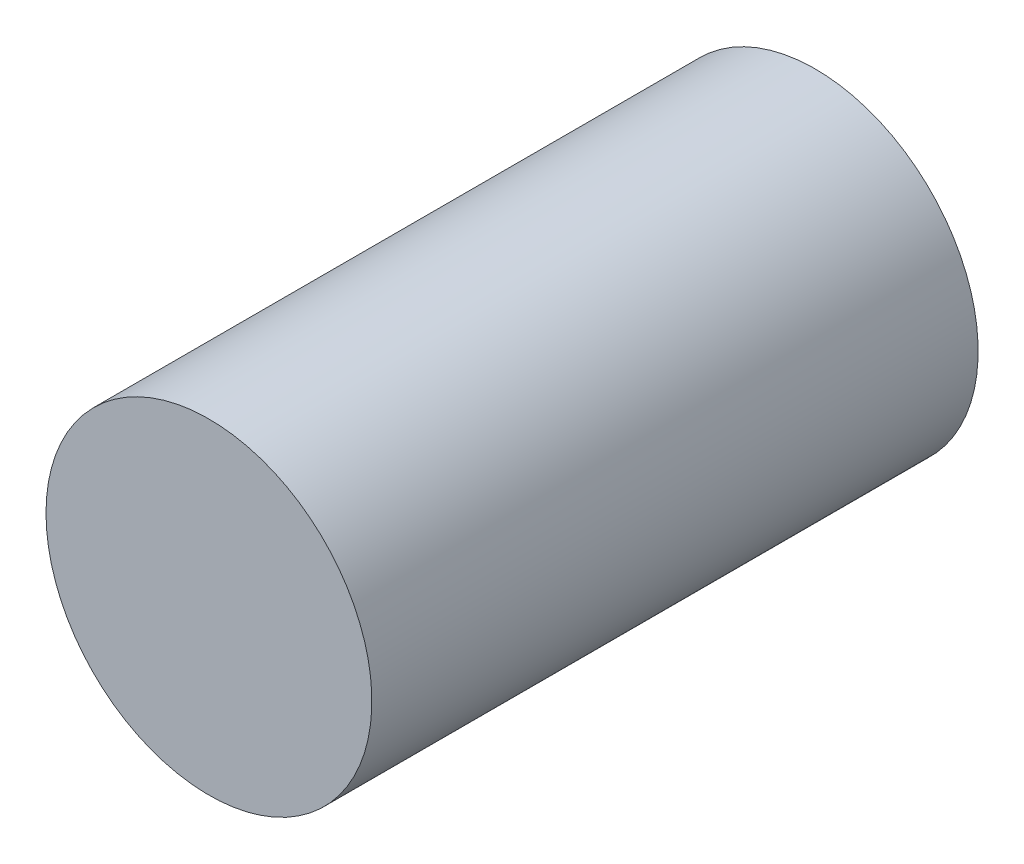
ISO-10303-21;
HEADER;
FILE_DESCRIPTION(('STEP AP214'),'2;1');
FILE_NAME('part.step','',(''),(''),'','','');
FILE_SCHEMA(('AUTOMOTIVE_DESIGN { 1 0 10303 214 1 1 1 1 }'));
ENDSEC;
DATA;
#1=APPLICATION_CONTEXT('core data for automotive mechanical design processes');
#2=APPLICATION_PROTOCOL_DEFINITION('international standard','automotive_design',2000,#1);
#3=PRODUCT_CONTEXT('',#1,'mechanical');
#4=PRODUCT('Part','Part','',(#3));
#5=PRODUCT_RELATED_PRODUCT_CATEGORY('part','',(#4));
#6=PRODUCT_DEFINITION_FORMATION('','',#4);
#7=PRODUCT_DEFINITION_CONTEXT('part definition',#1,'design');
#8=PRODUCT_DEFINITION('design','',#6,#7);
#9=PRODUCT_DEFINITION_SHAPE('','',#8);
#10=(LENGTH_UNIT() NAMED_UNIT(*) SI_UNIT(.MILLI.,.METRE.));
#11=(NAMED_UNIT(*) PLANE_ANGLE_UNIT() SI_UNIT($,.RADIAN.));
#12=(NAMED_UNIT(*) SI_UNIT($,.STERADIAN.) SOLID_ANGLE_UNIT());
#13=UNCERTAINTY_MEASURE_WITH_UNIT(LENGTH_MEASURE(1.E-05),#10,'distance_accuracy_value','');
#14=(GEOMETRIC_REPRESENTATION_CONTEXT(3) GLOBAL_UNCERTAINTY_ASSIGNED_CONTEXT((#13)) GLOBAL_UNIT_ASSIGNED_CONTEXT((#10,
#11,#12)) REPRESENTATION_CONTEXT('',''));
#15=CARTESIAN_POINT('',(0.,0.,0.));
#16=DIRECTION('',(0.,0.,1.));
#17=DIRECTION('',(1.,0.,0.));
#18=AXIS2_PLACEMENT_3D('',#15,#16,#17);
#19=CARTESIAN_POINT('',(0.,0.,-153.751));
#20=DIRECTION('',(0.,0.,-1.));
#21=DIRECTION('',(-1.,0.,0.));
#22=AXIS2_PLACEMENT_3D('',#19,#20,#21);
#23=PLANE('',#22);
#24=CARTESIAN_POINT('',(0.,0.,-153.751));
#25=DIRECTION('',(0.,0.,-1.));
#26=DIRECTION('',(-1.,0.,0.));
#27=AXIS2_PLACEMENT_3D('',#24,#25,#26);
#28=CIRCLE('',#27,41.25);
#29=CARTESIAN_POINT('',(-41.25,0.,-153.751));
#30=VERTEX_POINT('',#29);
#31=EDGE_CURVE('E38',#30,#30,#28,.F.);
#32=ORIENTED_EDGE('',*,*,#31,.F.);
#33=EDGE_LOOP('',(#32));
#34=FACE_BOUND('',#33,.T.);
#35=ADVANCED_FACE('F35',(#34),#23,.T.);
#36=CARTESIAN_POINT('',(0.,0.,-0.25));
#37=DIRECTION('',(0.,0.,-1.));
#38=DIRECTION('',(-1.,0.,0.));
#39=AXIS2_PLACEMENT_3D('',#36,#37,#38);
#40=PLANE('',#39);
#41=CARTESIAN_POINT('',(0.,0.,-0.25));
#42=DIRECTION('',(0.,0.,-1.));
#43=DIRECTION('',(-1.,0.,0.));
#44=AXIS2_PLACEMENT_3D('',#41,#42,#43);
#45=CIRCLE('',#44,41.25);
#46=CARTESIAN_POINT('',(-41.25,0.,-0.25));
#47=VERTEX_POINT('',#46);
#48=EDGE_CURVE('E10',#47,#47,#45,.T.);
#49=ORIENTED_EDGE('',*,*,#48,.F.);
#50=EDGE_LOOP('',(#49));
#51=FACE_BOUND('',#50,.T.);
#52=ADVANCED_FACE('F58',(#51),#40,.F.);
#53=CARTESIAN_POINT('',(0.,0.,-0.25));
#54=DIRECTION('',(0.,0.,-1.));
#55=DIRECTION('',(-1.,0.,0.));
#56=AXIS2_PLACEMENT_3D('',#53,#54,#55);
#57=CYLINDRICAL_SURFACE('',#56,41.25);
#58=ORIENTED_EDGE('',*,*,#31,.T.);
#59=EDGE_LOOP('',(#58));
#60=FACE_BOUND('',#59,.T.);
#61=ORIENTED_EDGE('',*,*,#48,.T.);
#62=EDGE_LOOP('',(#61));
#63=FACE_BOUND('',#62,.T.);
#64=ADVANCED_FACE('F55',(#60,#63),#57,.T.);
#65=CLOSED_SHELL('',(#35,#52,#64));
#66=MANIFOLD_SOLID_BREP('B2',#65);
#67=ADVANCED_BREP_SHAPE_REPRESENTATION('',(#18,#66),#14);
#68=SHAPE_DEFINITION_REPRESENTATION(#9,#67);
ENDSEC;
END-ISO-10303-21;
